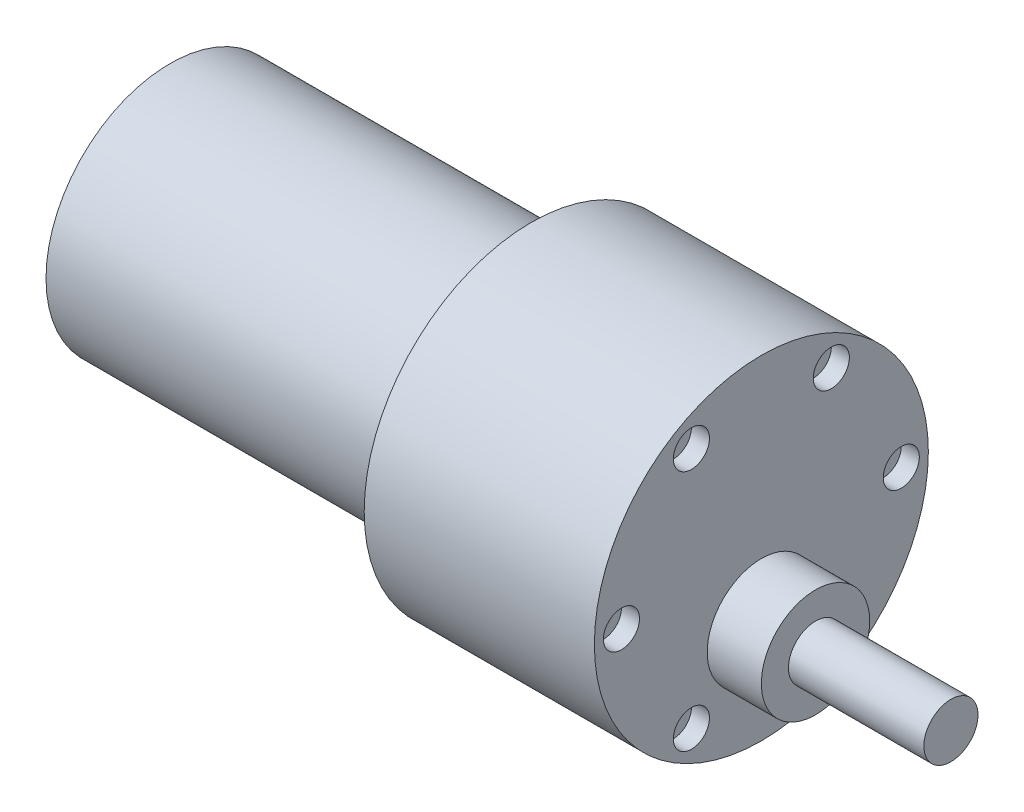
ISO-10303-21;
HEADER;
FILE_DESCRIPTION(('STEP AP214'),'2;1');
FILE_NAME('part.step','',(''),(''),'','','');
FILE_SCHEMA(('AUTOMOTIVE_DESIGN { 1 0 10303 214 1 1 1 1 }'));
ENDSEC;
DATA;
#1=APPLICATION_CONTEXT('core data for automotive mechanical design processes');
#2=APPLICATION_PROTOCOL_DEFINITION('international standard','automotive_design',2000,#1);
#3=PRODUCT_CONTEXT('',#1,'mechanical');
#4=PRODUCT('Part','Part','',(#3));
#5=PRODUCT_RELATED_PRODUCT_CATEGORY('part','',(#4));
#6=PRODUCT_DEFINITION_FORMATION('','',#4);
#7=PRODUCT_DEFINITION_CONTEXT('part definition',#1,'design');
#8=PRODUCT_DEFINITION('design','',#6,#7);
#9=PRODUCT_DEFINITION_SHAPE('','',#8);
#10=(LENGTH_UNIT() NAMED_UNIT(*) SI_UNIT(.MILLI.,.METRE.));
#11=(NAMED_UNIT(*) PLANE_ANGLE_UNIT() SI_UNIT($,.RADIAN.));
#12=(NAMED_UNIT(*) SI_UNIT($,.STERADIAN.) SOLID_ANGLE_UNIT());
#13=UNCERTAINTY_MEASURE_WITH_UNIT(LENGTH_MEASURE(1.E-05),#10,'distance_accuracy_value','');
#14=(GEOMETRIC_REPRESENTATION_CONTEXT(3) GLOBAL_UNCERTAINTY_ASSIGNED_CONTEXT((#13)) GLOBAL_UNIT_ASSIGNED_CONTEXT((#10,
#11,#12)) REPRESENTATION_CONTEXT('',''));
#15=CARTESIAN_POINT('',(0.,0.,0.));
#16=DIRECTION('',(0.,0.,1.));
#17=DIRECTION('',(1.,0.,0.));
#18=AXIS2_PLACEMENT_3D('',#15,#16,#17);
#19=CARTESIAN_POINT('',(-25.5,0.,0.));
#20=DIRECTION('',(1.,0.,0.));
#21=DIRECTION('',(0.,0.,-1.));
#22=AXIS2_PLACEMENT_3D('',#19,#20,#21);
#23=CYLINDRICAL_SURFACE('',#22,18.5);
#24=CARTESIAN_POINT('',(-25.5,0.,0.));
#25=DIRECTION('',(1.,0.,0.));
#26=DIRECTION('',(0.,0.,-1.));
#27=AXIS2_PLACEMENT_3D('',#24,#25,#26);
#28=CIRCLE('',#27,18.5);
#29=CARTESIAN_POINT('',(-25.5,0.,-18.5));
#30=VERTEX_POINT('',#29);
#31=EDGE_CURVE('E42',#30,#30,#28,.T.);
#32=ORIENTED_EDGE('',*,*,#31,.T.);
#33=EDGE_LOOP('',(#32));
#34=FACE_BOUND('',#33,.T.);
#35=CARTESIAN_POINT('',(0.,0.,0.));
#36=DIRECTION('',(1.,0.,0.));
#37=DIRECTION('',(0.,0.,-1.));
#38=AXIS2_PLACEMENT_3D('',#35,#36,#37);
#39=CIRCLE('',#38,18.5);
#40=CARTESIAN_POINT('',(0.,0.,-18.5));
#41=VERTEX_POINT('',#40);
#42=EDGE_CURVE('E33',#41,#41,#39,.T.);
#43=ORIENTED_EDGE('',*,*,#42,.F.);
#44=EDGE_LOOP('',(#43));
#45=FACE_BOUND('',#44,.T.);
#46=ADVANCED_FACE('F30',(#34,#45),#23,.T.);
#47=CARTESIAN_POINT('',(-25.5,0.,0.));
#48=DIRECTION('',(1.,0.,0.));
#49=DIRECTION('',(0.,0.,-1.));
#50=AXIS2_PLACEMENT_3D('',#47,#48,#49);
#51=PLANE('',#50);
#52=CARTESIAN_POINT('',(-25.5,0.,0.));
#53=DIRECTION('',(-1.,0.,0.));
#54=DIRECTION('',(0.,0.,1.));
#55=AXIS2_PLACEMENT_3D('',#52,#53,#54);
#56=CIRCLE('',#55,13.75);
#57=CARTESIAN_POINT('',(-25.5,0.,13.75));
#58=VERTEX_POINT('',#57);
#59=EDGE_CURVE('E37',#58,#58,#56,.T.);
#60=ORIENTED_EDGE('',*,*,#59,.F.);
#61=EDGE_LOOP('',(#60));
#62=FACE_BOUND('',#61,.T.);
#63=ORIENTED_EDGE('',*,*,#31,.F.);
#64=EDGE_LOOP('',(#63));
#65=FACE_BOUND('',#64,.T.);
#66=ADVANCED_FACE('F65',(#62,#65),#51,.F.);
#67=CARTESIAN_POINT('',(0.,0.,0.));
#68=DIRECTION('',(1.,0.,0.));
#69=DIRECTION('',(0.,0.,-1.));
#70=AXIS2_PLACEMENT_3D('',#67,#68,#69);
#71=PLANE('',#70);
#72=CARTESIAN_POINT('',(0.,0.,15.5));
#73=DIRECTION('',(1.,0.,0.));
#74=DIRECTION('',(0.,0.,-1.));
#75=AXIS2_PLACEMENT_3D('',#72,#73,#74);
#76=CIRCLE('',#75,2.);
#77=CARTESIAN_POINT('',(0.,0.,13.5));
#78=VERTEX_POINT('',#77);
#79=EDGE_CURVE('E154',#78,#78,#76,.T.);
#80=ORIENTED_EDGE('',*,*,#79,.F.);
#81=EDGE_LOOP('',(#80));
#82=FACE_BOUND('',#81,.T.);
#83=CARTESIAN_POINT('',(0.,-13.4233937586587,7.75000000000016));
#84=DIRECTION('',(1.,0.,0.));
#85=DIRECTION('',(0.,0.,-1.));
#86=AXIS2_PLACEMENT_3D('',#83,#84,#85);
#87=CIRCLE('',#86,2.);
#88=CARTESIAN_POINT('',(0.,-13.4233937586587,5.75000000000016));
#89=VERTEX_POINT('',#88);
#90=EDGE_CURVE('E165',#89,#89,#87,.T.);
#91=ORIENTED_EDGE('',*,*,#90,.F.);
#92=EDGE_LOOP('',(#91));
#93=FACE_BOUND('',#92,.T.);
#94=CARTESIAN_POINT('',(0.,-13.4233937586589,-7.74999999999987));
#95=DIRECTION('',(1.,0.,0.));
#96=DIRECTION('',(0.,0.,-1.));
#97=AXIS2_PLACEMENT_3D('',#94,#95,#96);
#98=CIRCLE('',#97,2.);
#99=CARTESIAN_POINT('',(0.,-13.4233937586589,-9.74999999999987));
#100=VERTEX_POINT('',#99);
#101=EDGE_CURVE('E164',#100,#100,#98,.T.);
#102=ORIENTED_EDGE('',*,*,#101,.F.);
#103=EDGE_LOOP('',(#102));
#104=FACE_BOUND('',#103,.T.);
#105=CARTESIAN_POINT('',(0.,-1.08235921504137E-13,-15.5));
#106=DIRECTION('',(1.,0.,0.));
#107=DIRECTION('',(0.,0.,-1.));
#108=AXIS2_PLACEMENT_3D('',#105,#106,#107);
#109=CIRCLE('',#108,2.);
#110=CARTESIAN_POINT('',(0.,-1.08235921504137E-13,-17.5));
#111=VERTEX_POINT('',#110);
#112=EDGE_CURVE('E182',#111,#111,#109,.T.);
#113=ORIENTED_EDGE('',*,*,#112,.F.);
#114=EDGE_LOOP('',(#113));
#115=FACE_BOUND('',#114,.T.);
#116=CARTESIAN_POINT('',(0.,13.4233937586588,-7.75000000000006));
#117=DIRECTION('',(1.,0.,0.));
#118=DIRECTION('',(0.,0.,-1.));
#119=AXIS2_PLACEMENT_3D('',#116,#117,#118);
#120=CIRCLE('',#119,2.);
#121=CARTESIAN_POINT('',(0.,13.4233937586588,-9.75000000000006));
#122=VERTEX_POINT('',#121);
#123=EDGE_CURVE('E176',#122,#122,#120,.T.);
#124=ORIENTED_EDGE('',*,*,#123,.F.);
#125=EDGE_LOOP('',(#124));
#126=FACE_BOUND('',#125,.T.);
#127=CARTESIAN_POINT('',(0.,13.4233937586588,7.74999999999997));
#128=DIRECTION('',(1.,0.,0.));
#129=DIRECTION('',(0.,0.,-1.));
#130=AXIS2_PLACEMENT_3D('',#127,#128,#129);
#131=CIRCLE('',#130,2.);
#132=CARTESIAN_POINT('',(0.,13.4233937586588,5.74999999999997));
#133=VERTEX_POINT('',#132);
#134=EDGE_CURVE('E170',#133,#133,#131,.T.);
#135=ORIENTED_EDGE('',*,*,#134,.F.);
#136=EDGE_LOOP('',(#135));
#137=FACE_BOUND('',#136,.T.);
#138=CARTESIAN_POINT('',(0.,-7.,0.));
#139=DIRECTION('',(1.,0.,0.));
#140=DIRECTION('',(0.,0.,-1.));
#141=AXIS2_PLACEMENT_3D('',#138,#139,#140);
#142=CIRCLE('',#141,6.);
#143=CARTESIAN_POINT('',(0.,-7.,-6.));
#144=VERTEX_POINT('',#143);
#145=EDGE_CURVE('E52',#144,#144,#142,.T.);
#146=ORIENTED_EDGE('',*,*,#145,.F.);
#147=EDGE_LOOP('',(#146));
#148=FACE_BOUND('',#147,.T.);
#149=ORIENTED_EDGE('',*,*,#42,.T.);
#150=EDGE_LOOP('',(#149));
#151=FACE_BOUND('',#150,.T.);
#152=ADVANCED_FACE('F62',(#82,#93,#104,#115,#126,#137,#148,#151),#71,.T.);
#153=CARTESIAN_POINT('',(-65.5,0.,0.));
#154=DIRECTION('',(1.,0.,0.));
#155=DIRECTION('',(0.,0.,-1.));
#156=AXIS2_PLACEMENT_3D('',#153,#154,#155);
#157=CYLINDRICAL_SURFACE('',#156,13.75);
#158=CARTESIAN_POINT('',(-65.5,0.,0.));
#159=DIRECTION('',(-1.,0.,0.));
#160=DIRECTION('',(0.,0.,1.));
#161=AXIS2_PLACEMENT_3D('',#158,#159,#160);
#162=CIRCLE('',#161,13.75);
#163=CARTESIAN_POINT('',(-65.5,0.,13.75));
#164=VERTEX_POINT('',#163);
#165=EDGE_CURVE('E51',#164,#164,#162,.T.);
#166=ORIENTED_EDGE('',*,*,#165,.F.);
#167=EDGE_LOOP('',(#166));
#168=FACE_BOUND('',#167,.T.);
#169=ORIENTED_EDGE('',*,*,#59,.T.);
#170=EDGE_LOOP('',(#169));
#171=FACE_BOUND('',#170,.T.);
#172=ADVANCED_FACE('F74',(#168,#171),#157,.T.);
#173=CARTESIAN_POINT('',(-65.5,0.,0.));
#174=DIRECTION('',(-1.,0.,0.));
#175=DIRECTION('',(0.,0.,1.));
#176=AXIS2_PLACEMENT_3D('',#173,#174,#175);
#177=PLANE('',#176);
#178=ORIENTED_EDGE('',*,*,#165,.T.);
#179=EDGE_LOOP('',(#178));
#180=FACE_BOUND('',#179,.T.);
#181=ADVANCED_FACE('F81',(#180),#177,.T.);
#182=CARTESIAN_POINT('',(6.,-7.,0.));
#183=DIRECTION('',(-1.,0.,0.));
#184=DIRECTION('',(0.,0.,1.));
#185=AXIS2_PLACEMENT_3D('',#182,#183,#184);
#186=CYLINDRICAL_SURFACE('',#185,6.);
#187=CARTESIAN_POINT('',(6.,-7.,0.));
#188=DIRECTION('',(1.,0.,0.));
#189=DIRECTION('',(0.,0.,-1.));
#190=AXIS2_PLACEMENT_3D('',#187,#188,#189);
#191=CIRCLE('',#190,6.);
#192=CARTESIAN_POINT('',(6.,-7.,-6.));
#193=VERTEX_POINT('',#192);
#194=EDGE_CURVE('E48',#193,#193,#191,.T.);
#195=ORIENTED_EDGE('',*,*,#194,.F.);
#196=EDGE_LOOP('',(#195));
#197=FACE_BOUND('',#196,.T.);
#198=ORIENTED_EDGE('',*,*,#145,.T.);
#199=EDGE_LOOP('',(#198));
#200=FACE_BOUND('',#199,.T.);
#201=ADVANCED_FACE('F85',(#197,#200),#186,.T.);
#202=CARTESIAN_POINT('',(6.,-7.,0.));
#203=DIRECTION('',(1.,0.,0.));
#204=DIRECTION('',(0.,0.,-1.));
#205=AXIS2_PLACEMENT_3D('',#202,#203,#204);
#206=PLANE('',#205);
#207=CARTESIAN_POINT('',(6.,-7.,0.));
#208=DIRECTION('',(1.,0.,0.));
#209=DIRECTION('',(0.,0.,-1.));
#210=AXIS2_PLACEMENT_3D('',#207,#208,#209);
#211=CIRCLE('',#210,3.);
#212=CARTESIAN_POINT('',(6.,-7.,-3.));
#213=VERTEX_POINT('',#212);
#214=EDGE_CURVE('E10',#213,#213,#211,.T.);
#215=ORIENTED_EDGE('',*,*,#214,.F.);
#216=EDGE_LOOP('',(#215));
#217=FACE_BOUND('',#216,.T.);
#218=ORIENTED_EDGE('',*,*,#194,.T.);
#219=EDGE_LOOP('',(#218));
#220=FACE_BOUND('',#219,.T.);
#221=ADVANCED_FACE('F89',(#217,#220),#206,.T.);
#222=CARTESIAN_POINT('',(21.,-7.,0.));
#223=DIRECTION('',(-1.,0.,0.));
#224=DIRECTION('',(0.,0.,1.));
#225=AXIS2_PLACEMENT_3D('',#222,#223,#224);
#226=CYLINDRICAL_SURFACE('',#225,3.);
#227=CARTESIAN_POINT('',(21.,-7.,0.));
#228=DIRECTION('',(1.,0.,0.));
#229=DIRECTION('',(0.,0.,-1.));
#230=AXIS2_PLACEMENT_3D('',#227,#228,#229);
#231=CIRCLE('',#230,3.);
#232=CARTESIAN_POINT('',(21.,-7.,-3.));
#233=VERTEX_POINT('',#232);
#234=EDGE_CURVE('E46',#233,#233,#231,.T.);
#235=ORIENTED_EDGE('',*,*,#234,.F.);
#236=EDGE_LOOP('',(#235));
#237=FACE_BOUND('',#236,.T.);
#238=ORIENTED_EDGE('',*,*,#214,.T.);
#239=EDGE_LOOP('',(#238));
#240=FACE_BOUND('',#239,.T.);
#241=ADVANCED_FACE('F93',(#237,#240),#226,.T.);
#242=CARTESIAN_POINT('',(21.,-7.,0.));
#243=DIRECTION('',(1.,0.,0.));
#244=DIRECTION('',(0.,0.,-1.));
#245=AXIS2_PLACEMENT_3D('',#242,#243,#244);
#246=PLANE('',#245);
#247=ORIENTED_EDGE('',*,*,#234,.T.);
#248=EDGE_LOOP('',(#247));
#249=FACE_BOUND('',#248,.T.);
#250=ADVANCED_FACE('F97',(#249),#246,.T.);
#251=CARTESIAN_POINT('',(-2.,13.4233937586588,7.74999999999997));
#252=DIRECTION('',(1.,0.,0.));
#253=DIRECTION('',(0.,0.,-1.));
#254=AXIS2_PLACEMENT_3D('',#251,#252,#253);
#255=CYLINDRICAL_SURFACE('',#254,2.);
#256=CARTESIAN_POINT('',(-2.,13.4233937586588,7.74999999999997));
#257=DIRECTION('',(1.,0.,0.));
#258=DIRECTION('',(0.,0.,-1.));
#259=AXIS2_PLACEMENT_3D('',#256,#257,#258);
#260=CIRCLE('',#259,2.);
#261=CARTESIAN_POINT('',(-2.,13.4233937586588,5.74999999999997));
#262=VERTEX_POINT('',#261);
#263=EDGE_CURVE('E158',#262,#262,#260,.T.);
#264=ORIENTED_EDGE('',*,*,#263,.F.);
#265=EDGE_LOOP('',(#264));
#266=FACE_BOUND('',#265,.T.);
#267=ORIENTED_EDGE('',*,*,#134,.T.);
#268=EDGE_LOOP('',(#267));
#269=FACE_BOUND('',#268,.T.);
#270=ADVANCED_FACE('F101',(#266,#269),#255,.F.);
#271=CARTESIAN_POINT('',(-2.,13.4233937586588,7.74999999999997));
#272=DIRECTION('',(1.,0.,0.));
#273=DIRECTION('',(0.,0.,-1.));
#274=AXIS2_PLACEMENT_3D('',#271,#272,#273);
#275=PLANE('',#274);
#276=ORIENTED_EDGE('',*,*,#263,.T.);
#277=EDGE_LOOP('',(#276));
#278=FACE_BOUND('',#277,.T.);
#279=ADVANCED_FACE('F124',(#278),#275,.T.);
#280=CARTESIAN_POINT('',(-2.,13.4233937586588,-7.75000000000006));
#281=DIRECTION('',(1.,0.,0.));
#282=DIRECTION('',(0.,0.,-1.));
#283=AXIS2_PLACEMENT_3D('',#280,#281,#282);
#284=CYLINDRICAL_SURFACE('',#283,2.);
#285=CARTESIAN_POINT('',(-2.,13.4233937586588,-7.75000000000006));
#286=DIRECTION('',(1.,0.,0.));
#287=DIRECTION('',(0.,0.,-1.));
#288=AXIS2_PLACEMENT_3D('',#285,#286,#287);
#289=CIRCLE('',#288,2.);
#290=CARTESIAN_POINT('',(-2.,13.4233937586588,-9.75000000000006));
#291=VERTEX_POINT('',#290);
#292=EDGE_CURVE('E173',#291,#291,#289,.T.);
#293=ORIENTED_EDGE('',*,*,#292,.F.);
#294=EDGE_LOOP('',(#293));
#295=FACE_BOUND('',#294,.T.);
#296=ORIENTED_EDGE('',*,*,#123,.T.);
#297=EDGE_LOOP('',(#296));
#298=FACE_BOUND('',#297,.T.);
#299=ADVANCED_FACE('F121',(#295,#298),#284,.F.);
#300=CARTESIAN_POINT('',(-2.,13.4233937586588,-7.75000000000006));
#301=DIRECTION('',(1.,0.,0.));
#302=DIRECTION('',(0.,0.,-1.));
#303=AXIS2_PLACEMENT_3D('',#300,#301,#302);
#304=PLANE('',#303);
#305=ORIENTED_EDGE('',*,*,#292,.T.);
#306=EDGE_LOOP('',(#305));
#307=FACE_BOUND('',#306,.T.);
#308=ADVANCED_FACE('F116',(#307),#304,.T.);
#309=CARTESIAN_POINT('',(-2.,-1.08235921504137E-13,-15.5));
#310=DIRECTION('',(1.,0.,0.));
#311=DIRECTION('',(0.,0.,-1.));
#312=AXIS2_PLACEMENT_3D('',#309,#310,#311);
#313=CYLINDRICAL_SURFACE('',#312,2.);
#314=CARTESIAN_POINT('',(-2.,-1.08235921504137E-13,-15.5));
#315=DIRECTION('',(1.,0.,0.));
#316=DIRECTION('',(0.,0.,-1.));
#317=AXIS2_PLACEMENT_3D('',#314,#315,#316);
#318=CIRCLE('',#317,2.);
#319=CARTESIAN_POINT('',(-2.,-1.08235921504137E-13,-17.5));
#320=VERTEX_POINT('',#319);
#321=EDGE_CURVE('E179',#320,#320,#318,.T.);
#322=ORIENTED_EDGE('',*,*,#321,.F.);
#323=EDGE_LOOP('',(#322));
#324=FACE_BOUND('',#323,.T.);
#325=ORIENTED_EDGE('',*,*,#112,.T.);
#326=EDGE_LOOP('',(#325));
#327=FACE_BOUND('',#326,.T.);
#328=ADVANCED_FACE('F113',(#324,#327),#313,.F.);
#329=CARTESIAN_POINT('',(-2.,-1.08235921504137E-13,-15.5));
#330=DIRECTION('',(1.,0.,0.));
#331=DIRECTION('',(0.,0.,-1.));
#332=AXIS2_PLACEMENT_3D('',#329,#330,#331);
#333=PLANE('',#332);
#334=ORIENTED_EDGE('',*,*,#321,.T.);
#335=EDGE_LOOP('',(#334));
#336=FACE_BOUND('',#335,.T.);
#337=ADVANCED_FACE('F107',(#336),#333,.T.);
#338=CARTESIAN_POINT('',(-2.,-13.4233937586589,-7.74999999999987));
#339=DIRECTION('',(1.,0.,0.));
#340=DIRECTION('',(0.,0.,-1.));
#341=AXIS2_PLACEMENT_3D('',#338,#339,#340);
#342=CYLINDRICAL_SURFACE('',#341,2.);
#343=CARTESIAN_POINT('',(-2.,-13.4233937586589,-7.74999999999987));
#344=DIRECTION('',(1.,0.,0.));
#345=DIRECTION('',(0.,0.,-1.));
#346=AXIS2_PLACEMENT_3D('',#343,#344,#345);
#347=CIRCLE('',#346,2.);
#348=CARTESIAN_POINT('',(-2.,-13.4233937586589,-9.74999999999987));
#349=VERTEX_POINT('',#348);
#350=EDGE_CURVE('E185',#349,#349,#347,.T.);
#351=ORIENTED_EDGE('',*,*,#350,.F.);
#352=EDGE_LOOP('',(#351));
#353=FACE_BOUND('',#352,.T.);
#354=ORIENTED_EDGE('',*,*,#101,.T.);
#355=EDGE_LOOP('',(#354));
#356=FACE_BOUND('',#355,.T.);
#357=ADVANCED_FACE('F103',(#353,#356),#342,.F.);
#358=CARTESIAN_POINT('',(-2.,-13.4233937586589,-7.74999999999987));
#359=DIRECTION('',(1.,0.,0.));
#360=DIRECTION('',(0.,0.,-1.));
#361=AXIS2_PLACEMENT_3D('',#358,#359,#360);
#362=PLANE('',#361);
#363=ORIENTED_EDGE('',*,*,#350,.T.);
#364=EDGE_LOOP('',(#363));
#365=FACE_BOUND('',#364,.T.);
#366=ADVANCED_FACE('F106',(#365),#362,.T.);
#367=CARTESIAN_POINT('',(-2.,-13.4233937586587,7.75000000000016));
#368=DIRECTION('',(1.,0.,0.));
#369=DIRECTION('',(0.,0.,-1.));
#370=AXIS2_PLACEMENT_3D('',#367,#368,#369);
#371=CYLINDRICAL_SURFACE('',#370,2.);
#372=CARTESIAN_POINT('',(-2.,-13.4233937586587,7.75000000000016));
#373=DIRECTION('',(1.,0.,0.));
#374=DIRECTION('',(0.,0.,-1.));
#375=AXIS2_PLACEMENT_3D('',#372,#373,#374);
#376=CIRCLE('',#375,2.);
#377=CARTESIAN_POINT('',(-2.,-13.4233937586587,5.75000000000016));
#378=VERTEX_POINT('',#377);
#379=EDGE_CURVE('E161',#378,#378,#376,.T.);
#380=ORIENTED_EDGE('',*,*,#379,.F.);
#381=EDGE_LOOP('',(#380));
#382=FACE_BOUND('',#381,.T.);
#383=ORIENTED_EDGE('',*,*,#90,.T.);
#384=EDGE_LOOP('',(#383));
#385=FACE_BOUND('',#384,.T.);
#386=ADVANCED_FACE('F111',(#382,#385),#371,.F.);
#387=CARTESIAN_POINT('',(-2.,-13.4233937586587,7.75000000000016));
#388=DIRECTION('',(1.,0.,0.));
#389=DIRECTION('',(0.,0.,-1.));
#390=AXIS2_PLACEMENT_3D('',#387,#388,#389);
#391=PLANE('',#390);
#392=ORIENTED_EDGE('',*,*,#379,.T.);
#393=EDGE_LOOP('',(#392));
#394=FACE_BOUND('',#393,.T.);
#395=ADVANCED_FACE('F137',(#394),#391,.T.);
#396=CARTESIAN_POINT('',(-2.,0.,15.5));
#397=DIRECTION('',(1.,0.,0.));
#398=DIRECTION('',(0.,0.,-1.));
#399=AXIS2_PLACEMENT_3D('',#396,#397,#398);
#400=CYLINDRICAL_SURFACE('',#399,2.);
#401=CARTESIAN_POINT('',(-2.,0.,15.5));
#402=DIRECTION('',(1.,0.,0.));
#403=DIRECTION('',(0.,0.,-1.));
#404=AXIS2_PLACEMENT_3D('',#401,#402,#403);
#405=CIRCLE('',#404,2.);
#406=CARTESIAN_POINT('',(-2.,0.,13.5));
#407=VERTEX_POINT('',#406);
#408=EDGE_CURVE('E153',#407,#407,#405,.T.);
#409=ORIENTED_EDGE('',*,*,#408,.F.);
#410=EDGE_LOOP('',(#409));
#411=FACE_BOUND('',#410,.T.);
#412=ORIENTED_EDGE('',*,*,#79,.T.);
#413=EDGE_LOOP('',(#412));
#414=FACE_BOUND('',#413,.T.);
#415=ADVANCED_FACE('F141',(#411,#414),#400,.F.);
#416=CARTESIAN_POINT('',(-2.,0.,15.5));
#417=DIRECTION('',(1.,0.,0.));
#418=DIRECTION('',(0.,0.,-1.));
#419=AXIS2_PLACEMENT_3D('',#416,#417,#418);
#420=PLANE('',#419);
#421=ORIENTED_EDGE('',*,*,#408,.T.);
#422=EDGE_LOOP('',(#421));
#423=FACE_BOUND('',#422,.T.);
#424=ADVANCED_FACE('F145',(#423),#420,.T.);
#425=CLOSED_SHELL('',(#46,#66,#152,#172,#181,#201,#221,#241,#250,#270,#279,#299,#308,#328,#337,
#357,#366,#386,#395,#415,#424));
#426=MANIFOLD_SOLID_BREP('B2',#425);
#427=ADVANCED_BREP_SHAPE_REPRESENTATION('',(#18,#426),#14);
#428=SHAPE_DEFINITION_REPRESENTATION(#9,#427);
ENDSEC;
END-ISO-10303-21;
